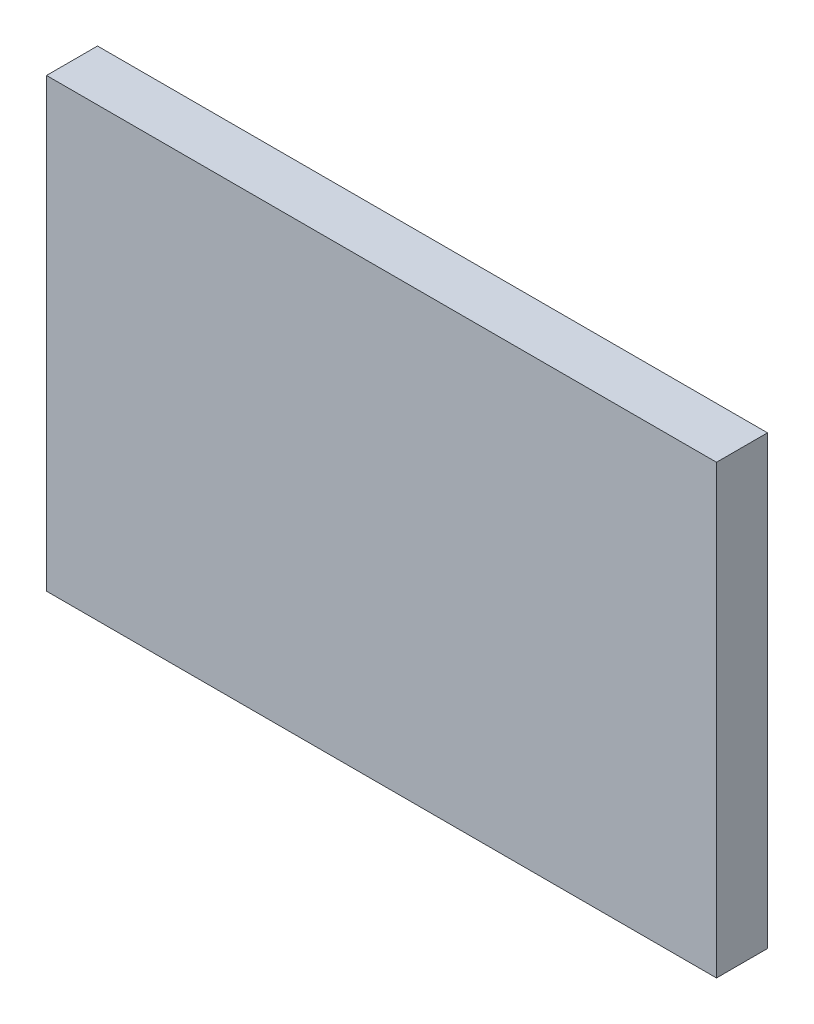
ISO-10303-21;
HEADER;
FILE_DESCRIPTION(('STEP AP214'),'2;1');
FILE_NAME('part.step','',(''),(''),'','','');
FILE_SCHEMA(('AUTOMOTIVE_DESIGN { 1 0 10303 214 1 1 1 1 }'));
ENDSEC;
DATA;
#1=APPLICATION_CONTEXT('core data for automotive mechanical design processes');
#2=APPLICATION_PROTOCOL_DEFINITION('international standard','automotive_design',2000,#1);
#3=PRODUCT_CONTEXT('',#1,'mechanical');
#4=PRODUCT('Part','Part','',(#3));
#5=PRODUCT_RELATED_PRODUCT_CATEGORY('part','',(#4));
#6=PRODUCT_DEFINITION_FORMATION('','',#4);
#7=PRODUCT_DEFINITION_CONTEXT('part definition',#1,'design');
#8=PRODUCT_DEFINITION('design','',#6,#7);
#9=PRODUCT_DEFINITION_SHAPE('','',#8);
#10=(LENGTH_UNIT() NAMED_UNIT(*) SI_UNIT(.MILLI.,.METRE.));
#11=(NAMED_UNIT(*) PLANE_ANGLE_UNIT() SI_UNIT($,.RADIAN.));
#12=(NAMED_UNIT(*) SI_UNIT($,.STERADIAN.) SOLID_ANGLE_UNIT());
#13=UNCERTAINTY_MEASURE_WITH_UNIT(LENGTH_MEASURE(1.E-05),#10,'distance_accuracy_value','');
#14=(GEOMETRIC_REPRESENTATION_CONTEXT(3) GLOBAL_UNCERTAINTY_ASSIGNED_CONTEXT((#13)) GLOBAL_UNIT_ASSIGNED_CONTEXT((#10,
#11,#12)) REPRESENTATION_CONTEXT('',''));
#15=CARTESIAN_POINT('',(0.,0.,0.));
#16=DIRECTION('',(0.,0.,1.));
#17=DIRECTION('',(1.,0.,0.));
#18=AXIS2_PLACEMENT_3D('',#15,#16,#17);
#19=CARTESIAN_POINT('',(0.,0.,2.9));
#20=DIRECTION('',(1.,0.,0.));
#21=DIRECTION('',(0.,0.,-1.));
#22=AXIS2_PLACEMENT_3D('',#19,#20,#21);
#23=PLANE('',#22);
#24=DIRECTION('',(0.,-1.,0.));
#25=VECTOR('',#24,1.);
#26=CARTESIAN_POINT('',(0.,0.,0.));
#27=LINE('',#26,#25);
#28=CARTESIAN_POINT('',(0.,0.,0.));
#29=VERTEX_POINT('',#28);
#30=CARTESIAN_POINT('',(0.,-25.4,0.));
#31=VERTEX_POINT('',#30);
#32=EDGE_CURVE('E96',#29,#31,#27,.T.);
#33=ORIENTED_EDGE('',*,*,#32,.T.);
#34=DIRECTION('',(0.,0.,-1.));
#35=VECTOR('',#34,1.);
#36=CARTESIAN_POINT('',(0.,-25.4,2.9));
#37=LINE('',#36,#35);
#38=CARTESIAN_POINT('',(0.,-25.4,2.9));
#39=VERTEX_POINT('',#38);
#40=EDGE_CURVE('E11',#39,#31,#37,.T.);
#41=ORIENTED_EDGE('',*,*,#40,.F.);
#42=DIRECTION('',(0.,-1.,0.));
#43=VECTOR('',#42,1.);
#44=CARTESIAN_POINT('',(0.,0.,2.9));
#45=LINE('',#44,#43);
#46=CARTESIAN_POINT('',(0.,0.,2.9));
#47=VERTEX_POINT('',#46);
#48=EDGE_CURVE('E84',#47,#39,#45,.T.);
#49=ORIENTED_EDGE('',*,*,#48,.F.);
#50=DIRECTION('',(0.,0.,-1.));
#51=VECTOR('',#50,1.);
#52=CARTESIAN_POINT('',(0.,0.,2.9));
#53=LINE('',#52,#51);
#54=EDGE_CURVE('E92',#47,#29,#53,.T.);
#55=ORIENTED_EDGE('',*,*,#54,.T.);
#56=EDGE_LOOP('',(#33,#41,#49,#55));
#57=FACE_BOUND('',#56,.T.);
#58=ADVANCED_FACE('F33',(#57),#23,.F.);
#59=CARTESIAN_POINT('',(0.,-25.4,2.9));
#60=DIRECTION('',(0.,1.,0.));
#61=DIRECTION('',(0.,0.,1.));
#62=AXIS2_PLACEMENT_3D('',#59,#60,#61);
#63=PLANE('',#62);
#64=DIRECTION('',(1.,0.,0.));
#65=VECTOR('',#64,1.);
#66=CARTESIAN_POINT('',(0.,-25.4,0.));
#67=LINE('',#66,#65);
#68=CARTESIAN_POINT('',(38.1,-25.4,0.));
#69=VERTEX_POINT('',#68);
#70=EDGE_CURVE('E88',#31,#69,#67,.T.);
#71=ORIENTED_EDGE('',*,*,#70,.T.);
#72=DIRECTION('',(0.,0.,-1.));
#73=VECTOR('',#72,1.);
#74=CARTESIAN_POINT('',(38.1,-25.4,2.9));
#75=LINE('',#74,#73);
#76=CARTESIAN_POINT('',(38.1,-25.4,2.9));
#77=VERTEX_POINT('',#76);
#78=EDGE_CURVE('E41',#77,#69,#75,.T.);
#79=ORIENTED_EDGE('',*,*,#78,.F.);
#80=DIRECTION('',(1.,0.,0.));
#81=VECTOR('',#80,1.);
#82=CARTESIAN_POINT('',(0.,-25.4,2.9));
#83=LINE('',#82,#81);
#84=EDGE_CURVE('E79',#39,#77,#83,.T.);
#85=ORIENTED_EDGE('',*,*,#84,.F.);
#86=ORIENTED_EDGE('',*,*,#40,.T.);
#87=EDGE_LOOP('',(#71,#79,#85,#86));
#88=FACE_BOUND('',#87,.T.);
#89=ADVANCED_FACE('F87',(#88),#63,.F.);
#90=CARTESIAN_POINT('',(38.1,0.,2.9));
#91=DIRECTION('',(-1.,0.,0.));
#92=DIRECTION('',(0.,0.,1.));
#93=AXIS2_PLACEMENT_3D('',#90,#91,#92);
#94=PLANE('',#93);
#95=DIRECTION('',(0.,1.,0.));
#96=VECTOR('',#95,1.);
#97=CARTESIAN_POINT('',(38.1,0.,0.));
#98=LINE('',#97,#96);
#99=CARTESIAN_POINT('',(38.1,0.,0.));
#100=VERTEX_POINT('',#99);
#101=EDGE_CURVE('E66',#69,#100,#98,.T.);
#102=ORIENTED_EDGE('',*,*,#101,.T.);
#103=DIRECTION('',(0.,0.,-1.));
#104=VECTOR('',#103,1.);
#105=CARTESIAN_POINT('',(38.1,0.,2.9));
#106=LINE('',#105,#104);
#107=CARTESIAN_POINT('',(38.1,0.,2.9));
#108=VERTEX_POINT('',#107);
#109=EDGE_CURVE('E89',#108,#100,#106,.T.);
#110=ORIENTED_EDGE('',*,*,#109,.F.);
#111=DIRECTION('',(0.,1.,0.));
#112=VECTOR('',#111,1.);
#113=CARTESIAN_POINT('',(38.1,0.,2.9));
#114=LINE('',#113,#112);
#115=EDGE_CURVE('E82',#77,#108,#114,.T.);
#116=ORIENTED_EDGE('',*,*,#115,.F.);
#117=ORIENTED_EDGE('',*,*,#78,.T.);
#118=EDGE_LOOP('',(#102,#110,#116,#117));
#119=FACE_BOUND('',#118,.T.);
#120=ADVANCED_FACE('F90',(#119),#94,.F.);
#121=CARTESIAN_POINT('',(0.,0.,2.9));
#122=DIRECTION('',(0.,-1.,0.));
#123=DIRECTION('',(0.,0.,-1.));
#124=AXIS2_PLACEMENT_3D('',#121,#122,#123);
#125=PLANE('',#124);
#126=DIRECTION('',(-1.,0.,0.));
#127=VECTOR('',#126,1.);
#128=CARTESIAN_POINT('',(0.,0.,0.));
#129=LINE('',#128,#127);
#130=EDGE_CURVE('E72',#100,#29,#129,.T.);
#131=ORIENTED_EDGE('',*,*,#130,.T.);
#132=ORIENTED_EDGE('',*,*,#54,.F.);
#133=DIRECTION('',(-1.,0.,0.));
#134=VECTOR('',#133,1.);
#135=CARTESIAN_POINT('',(0.,0.,2.9));
#136=LINE('',#135,#134);
#137=EDGE_CURVE('E49',#108,#47,#136,.T.);
#138=ORIENTED_EDGE('',*,*,#137,.F.);
#139=ORIENTED_EDGE('',*,*,#109,.T.);
#140=EDGE_LOOP('',(#131,#132,#138,#139));
#141=FACE_BOUND('',#140,.T.);
#142=ADVANCED_FACE('F103',(#141),#125,.F.);
#143=CARTESIAN_POINT('',(0.,0.,2.9));
#144=DIRECTION('',(0.,0.,1.));
#145=DIRECTION('',(1.,0.,0.));
#146=AXIS2_PLACEMENT_3D('',#143,#144,#145);
#147=PLANE('',#146);
#148=ORIENTED_EDGE('',*,*,#48,.T.);
#149=ORIENTED_EDGE('',*,*,#84,.T.);
#150=ORIENTED_EDGE('',*,*,#115,.T.);
#151=ORIENTED_EDGE('',*,*,#137,.T.);
#152=EDGE_LOOP('',(#148,#149,#150,#151));
#153=FACE_BOUND('',#152,.T.);
#154=ADVANCED_FACE('F80',(#153),#147,.T.);
#155=CARTESIAN_POINT('',(0.,0.,0.));
#156=DIRECTION('',(0.,0.,1.));
#157=DIRECTION('',(1.,0.,0.));
#158=AXIS2_PLACEMENT_3D('',#155,#156,#157);
#159=PLANE('',#158);
#160=ORIENTED_EDGE('',*,*,#32,.F.);
#161=ORIENTED_EDGE('',*,*,#130,.F.);
#162=ORIENTED_EDGE('',*,*,#101,.F.);
#163=ORIENTED_EDGE('',*,*,#70,.F.);
#164=EDGE_LOOP('',(#160,#161,#162,#163));
#165=FACE_BOUND('',#164,.T.);
#166=ADVANCED_FACE('F106',(#165),#159,.F.);
#167=CLOSED_SHELL('',(#58,#89,#120,#142,#154,#166));
#168=MANIFOLD_SOLID_BREP('B2',#167);
#169=ADVANCED_BREP_SHAPE_REPRESENTATION('',(#18,#168),#14);
#170=SHAPE_DEFINITION_REPRESENTATION(#9,#169);
ENDSEC;
END-ISO-10303-21;
